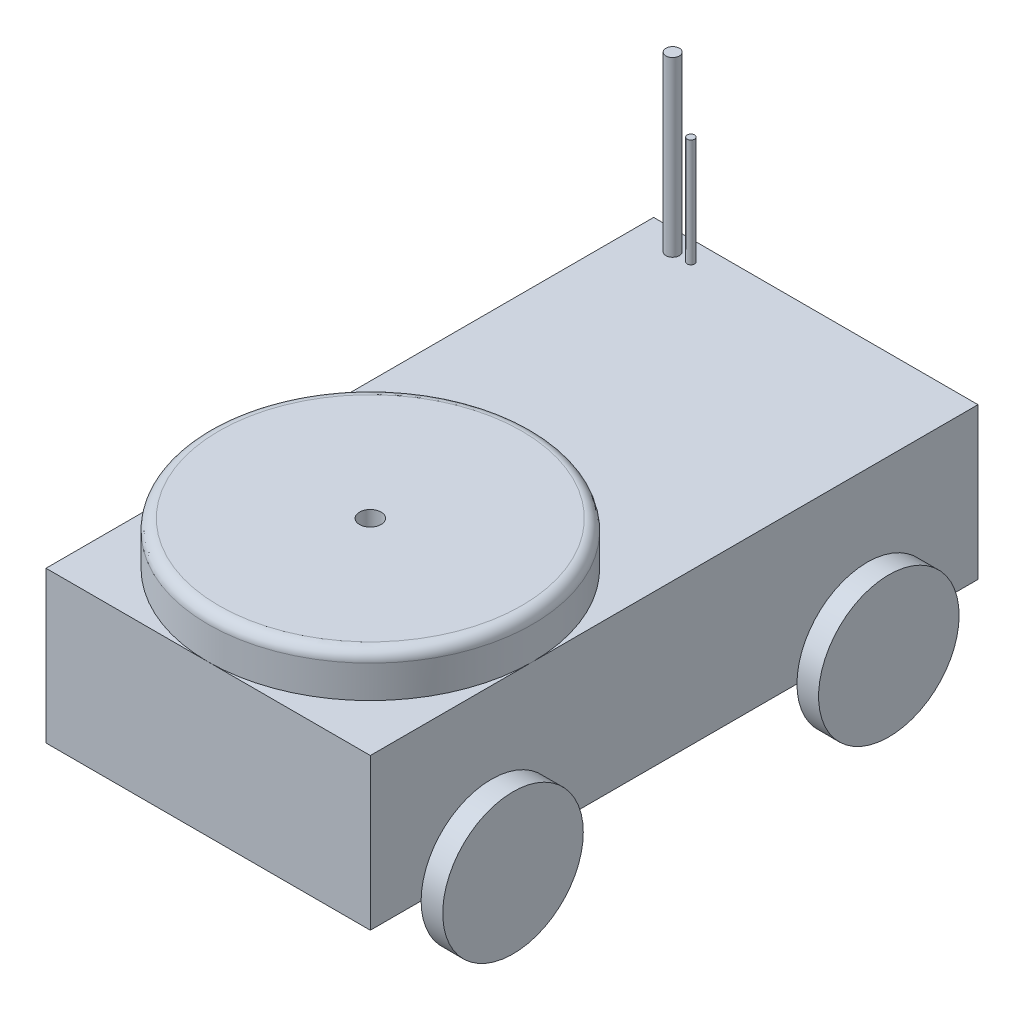
ISO-10303-21;
HEADER;
FILE_DESCRIPTION(('STEP AP214'),'2;1');
FILE_NAME('part.step','',(''),(''),'','','');
FILE_SCHEMA(('AUTOMOTIVE_DESIGN { 1 0 10303 214 1 1 1 1 }'));
ENDSEC;
DATA;
#1=APPLICATION_CONTEXT('core data for automotive mechanical design processes');
#2=APPLICATION_PROTOCOL_DEFINITION('international standard','automotive_design',2000,#1);
#3=PRODUCT_CONTEXT('',#1,'mechanical');
#4=PRODUCT('Part','Part','',(#3));
#5=PRODUCT_RELATED_PRODUCT_CATEGORY('part','',(#4));
#6=PRODUCT_DEFINITION_FORMATION('','',#4);
#7=PRODUCT_DEFINITION_CONTEXT('part definition',#1,'design');
#8=PRODUCT_DEFINITION('design','',#6,#7);
#9=PRODUCT_DEFINITION_SHAPE('','',#8);
#10=(LENGTH_UNIT() NAMED_UNIT(*) SI_UNIT(.MILLI.,.METRE.));
#11=(NAMED_UNIT(*) PLANE_ANGLE_UNIT() SI_UNIT($,.RADIAN.));
#12=(NAMED_UNIT(*) SI_UNIT($,.STERADIAN.) SOLID_ANGLE_UNIT());
#13=UNCERTAINTY_MEASURE_WITH_UNIT(LENGTH_MEASURE(1.E-05),#10,'distance_accuracy_value','');
#14=(GEOMETRIC_REPRESENTATION_CONTEXT(3) GLOBAL_UNCERTAINTY_ASSIGNED_CONTEXT((#13)) GLOBAL_UNIT_ASSIGNED_CONTEXT((#10,
#11,#12)) REPRESENTATION_CONTEXT('',''));
#15=CARTESIAN_POINT('',(0.,0.,0.));
#16=DIRECTION('',(0.,0.,1.));
#17=DIRECTION('',(1.,0.,0.));
#18=AXIS2_PLACEMENT_3D('',#15,#16,#17);
#19=CARTESIAN_POINT('',(0.,20.,0.));
#20=DIRECTION('',(0.,-1.,0.));
#21=DIRECTION('',(0.,0.,-1.));
#22=AXIS2_PLACEMENT_3D('',#19,#20,#21);
#23=CYLINDRICAL_SURFACE('',#22,75.);
#24=CARTESIAN_POINT('',(0.,15.,0.));
#25=DIRECTION('',(0.,1.,0.));
#26=DIRECTION('',(0.,0.,1.));
#27=AXIS2_PLACEMENT_3D('',#24,#25,#26);
#28=CIRCLE('',#27,75.);
#29=CARTESIAN_POINT('',(0.,15.,75.));
#30=VERTEX_POINT('',#29);
#31=EDGE_CURVE('E180',#30,#30,#28,.F.);
#32=ORIENTED_EDGE('',*,*,#31,.T.);
#33=EDGE_LOOP('',(#32));
#34=FACE_BOUND('',#33,.T.);
#35=CARTESIAN_POINT('',(0.,0.,0.));
#36=DIRECTION('',(0.,1.,0.));
#37=DIRECTION('',(0.,0.,1.));
#38=AXIS2_PLACEMENT_3D('',#35,#36,#37);
#39=CIRCLE('',#38,75.);
#40=CARTESIAN_POINT('',(0.,0.,75.));
#41=VERTEX_POINT('',#40);
#42=CARTESIAN_POINT('',(75.,0.,0.));
#43=VERTEX_POINT('',#42);
#44=EDGE_CURVE('E173',#41,#43,#39,.T.);
#45=ORIENTED_EDGE('',*,*,#44,.T.);
#46=CARTESIAN_POINT('',(-75.,0.,0.));
#47=VERTEX_POINT('',#46);
#48=EDGE_CURVE('E177',#43,#47,#39,.T.);
#49=ORIENTED_EDGE('',*,*,#48,.T.);
#50=EDGE_CURVE('E170',#47,#41,#39,.T.);
#51=ORIENTED_EDGE('',*,*,#50,.T.);
#52=EDGE_LOOP('',(#45,#49,#51));
#53=FACE_BOUND('',#52,.T.);
#54=ADVANCED_FACE('F39',(#34,#53),#23,.T.);
#55=CARTESIAN_POINT('',(0.,20.,0.));
#56=DIRECTION('',(0.,1.,0.));
#57=DIRECTION('',(0.,0.,1.));
#58=AXIS2_PLACEMENT_3D('',#55,#56,#57);
#59=PLANE('',#58);
#60=CARTESIAN_POINT('',(0.,20.,0.));
#61=DIRECTION('',(0.,1.,0.));
#62=DIRECTION('',(0.,0.,1.));
#63=AXIS2_PLACEMENT_3D('',#60,#61,#62);
#64=CIRCLE('',#63,5.);
#65=CARTESIAN_POINT('',(0.,20.,5.));
#66=VERTEX_POINT('',#65);
#67=EDGE_CURVE('E167',#66,#66,#64,.T.);
#68=ORIENTED_EDGE('',*,*,#67,.F.);
#69=EDGE_LOOP('',(#68));
#70=FACE_BOUND('',#69,.T.);
#71=CARTESIAN_POINT('',(0.,20.,0.));
#72=DIRECTION('',(0.,1.,0.));
#73=DIRECTION('',(0.,0.,1.));
#74=AXIS2_PLACEMENT_3D('',#71,#72,#73);
#75=CIRCLE('',#74,70.);
#76=CARTESIAN_POINT('',(0.,20.,70.));
#77=VERTEX_POINT('',#76);
#78=EDGE_CURVE('E176',#77,#77,#75,.T.);
#79=ORIENTED_EDGE('',*,*,#78,.T.);
#80=EDGE_LOOP('',(#79));
#81=FACE_BOUND('',#80,.T.);
#82=ADVANCED_FACE('F244',(#70,#81),#59,.T.);
#83=CARTESIAN_POINT('',(0.,15.,0.));
#84=DIRECTION('',(0.,1.,0.));
#85=DIRECTION('',(0.,0.,1.));
#86=AXIS2_PLACEMENT_3D('',#83,#84,#85);
#87=TOROIDAL_SURFACE('',#86,70.,5.);
#88=ORIENTED_EDGE('',*,*,#31,.F.);
#89=EDGE_LOOP('',(#88));
#90=FACE_BOUND('',#89,.T.);
#91=ORIENTED_EDGE('',*,*,#78,.F.);
#92=EDGE_LOOP('',(#91));
#93=FACE_BOUND('',#92,.T.);
#94=ADVANCED_FACE('F41',(#90,#93),#87,.T.);
#95=CARTESIAN_POINT('',(0.,20.,0.));
#96=DIRECTION('',(0.,-1.,0.));
#97=DIRECTION('',(0.,0.,-1.));
#98=AXIS2_PLACEMENT_3D('',#95,#96,#97);
#99=CYLINDRICAL_SURFACE('',#98,5.);
#100=ORIENTED_EDGE('',*,*,#67,.T.);
#101=EDGE_LOOP('',(#100));
#102=FACE_BOUND('',#101,.T.);
#103=CARTESIAN_POINT('',(0.,10.,0.));
#104=DIRECTION('',(0.,1.,0.));
#105=DIRECTION('',(0.,0.,1.));
#106=AXIS2_PLACEMENT_3D('',#103,#104,#105);
#107=CIRCLE('',#106,5.);
#108=CARTESIAN_POINT('',(0.,10.,5.));
#109=VERTEX_POINT('',#108);
#110=EDGE_CURVE('E166',#109,#109,#107,.T.);
#111=ORIENTED_EDGE('',*,*,#110,.F.);
#112=EDGE_LOOP('',(#111));
#113=FACE_BOUND('',#112,.T.);
#114=ADVANCED_FACE('F252',(#102,#113),#99,.F.);
#115=CARTESIAN_POINT('',(0.,10.,0.));
#116=DIRECTION('',(0.,1.,0.));
#117=DIRECTION('',(0.,0.,1.));
#118=AXIS2_PLACEMENT_3D('',#115,#116,#117);
#119=PLANE('',#118);
#120=ORIENTED_EDGE('',*,*,#110,.T.);
#121=EDGE_LOOP('',(#120));
#122=FACE_BOUND('',#121,.T.);
#123=ADVANCED_FACE('F255',(#122),#119,.T.);
#124=CARTESIAN_POINT('',(0.,0.,0.));
#125=DIRECTION('',(0.,-1.,0.));
#126=DIRECTION('',(0.,0.,-1.));
#127=AXIS2_PLACEMENT_3D('',#124,#125,#126);
#128=PLANE('',#127);
#129=ORIENTED_EDGE('',*,*,#44,.F.);
#130=DIRECTION('',(-1.,0.,0.));
#131=VECTOR('',#130,1.);
#132=CARTESIAN_POINT('',(-75.,0.,75.));
#133=LINE('',#132,#131);
#134=CARTESIAN_POINT('',(75.,0.,75.));
#135=VERTEX_POINT('',#134);
#136=EDGE_CURVE('E206',#135,#41,#133,.T.);
#137=ORIENTED_EDGE('',*,*,#136,.F.);
#138=DIRECTION('',(0.,0.,1.));
#139=VECTOR('',#138,1.);
#140=CARTESIAN_POINT('',(75.,0.,75.));
#141=LINE('',#140,#139);
#142=EDGE_CURVE('E205',#43,#135,#141,.T.);
#143=ORIENTED_EDGE('',*,*,#142,.F.);
#144=EDGE_LOOP('',(#129,#137,#143));
#145=FACE_BOUND('',#144,.T.);
#146=ADVANCED_FACE('F190',(#145),#128,.F.);
#147=CARTESIAN_POINT('',(-48.5777474499476,0.,-196.852154179683));
#148=DIRECTION('',(0.,-1.,0.));
#149=DIRECTION('',(0.,0.,-1.));
#150=AXIS2_PLACEMENT_3D('',#147,#148,#149);
#151=CIRCLE('',#150,1.72150087581956);
#152=CARTESIAN_POINT('',(-48.5777474499476,0.,-198.573655055502));
#153=VERTEX_POINT('',#152);
#154=EDGE_CURVE('E11',#153,#153,#151,.F.);
#155=ORIENTED_EDGE('',*,*,#154,.F.);
#156=EDGE_LOOP('',(#155));
#157=FACE_BOUND('',#156,.T.);
#158=CARTESIAN_POINT('',(-56.8266354819137,0.,-196.658461897024));
#159=DIRECTION('',(0.,-1.,0.));
#160=DIRECTION('',(0.,0.,-1.));
#161=AXIS2_PLACEMENT_3D('',#158,#159,#160);
#162=CIRCLE('',#161,3.10994561843031);
#163=CARTESIAN_POINT('',(-56.8266354819137,0.,-199.768407515455));
#164=VERTEX_POINT('',#163);
#165=EDGE_CURVE('E47',#164,#164,#162,.F.);
#166=ORIENTED_EDGE('',*,*,#165,.F.);
#167=EDGE_LOOP('',(#166));
#168=FACE_BOUND('',#167,.T.);
#169=ORIENTED_EDGE('',*,*,#48,.F.);
#170=CARTESIAN_POINT('',(75.,0.,-206.035433198381));
#171=VERTEX_POINT('',#170);
#172=EDGE_CURVE('E199',#171,#43,#141,.T.);
#173=ORIENTED_EDGE('',*,*,#172,.F.);
#174=DIRECTION('',(1.,0.,0.));
#175=VECTOR('',#174,1.);
#176=CARTESIAN_POINT('',(-75.,0.,-206.035433198381));
#177=LINE('',#176,#175);
#178=CARTESIAN_POINT('',(-75.,0.,-206.035433198381));
#179=VERTEX_POINT('',#178);
#180=EDGE_CURVE('E143',#179,#171,#177,.T.);
#181=ORIENTED_EDGE('',*,*,#180,.F.);
#182=DIRECTION('',(0.,0.,-1.));
#183=VECTOR('',#182,1.);
#184=CARTESIAN_POINT('',(-75.,0.,75.));
#185=LINE('',#184,#183);
#186=EDGE_CURVE('E152',#47,#179,#185,.T.);
#187=ORIENTED_EDGE('',*,*,#186,.F.);
#188=EDGE_LOOP('',(#169,#173,#181,#187));
#189=FACE_BOUND('',#188,.T.);
#190=ADVANCED_FACE('F187',(#157,#168,#189),#128,.F.);
#191=CARTESIAN_POINT('',(75.,-70.,75.));
#192=DIRECTION('',(-1.,0.,0.));
#193=DIRECTION('',(0.,0.,1.));
#194=AXIS2_PLACEMENT_3D('',#191,#192,#193);
#195=PLANE('',#194);
#196=CARTESIAN_POINT('',(75.,-70.,-154.802708442978));
#197=DIRECTION('',(1.,0.,0.));
#198=DIRECTION('',(0.,0.,-1.));
#199=AXIS2_PLACEMENT_3D('',#196,#197,#198);
#200=CIRCLE('',#199,32.5);
#201=CARTESIAN_POINT('',(75.,-70.,-187.302708442978));
#202=VERTEX_POINT('',#201);
#203=CARTESIAN_POINT('',(75.,-70.,-122.302708442978));
#204=VERTEX_POINT('',#203);
#205=EDGE_CURVE('E53',#202,#204,#200,.T.);
#206=ORIENTED_EDGE('',*,*,#205,.F.);
#207=DIRECTION('',(0.,0.,1.));
#208=VECTOR('',#207,1.);
#209=CARTESIAN_POINT('',(75.,-70.,75.));
#210=LINE('',#209,#208);
#211=CARTESIAN_POINT('',(75.,-70.,-206.035433198381));
#212=VERTEX_POINT('',#211);
#213=EDGE_CURVE('E120',#212,#202,#210,.T.);
#214=ORIENTED_EDGE('',*,*,#213,.F.);
#215=DIRECTION('',(0.,1.,0.));
#216=VECTOR('',#215,1.);
#217=CARTESIAN_POINT('',(75.,-70.,-206.035433198381));
#218=LINE('',#217,#216);
#219=EDGE_CURVE('E156',#212,#171,#218,.T.);
#220=ORIENTED_EDGE('',*,*,#219,.T.);
#221=ORIENTED_EDGE('',*,*,#172,.T.);
#222=ORIENTED_EDGE('',*,*,#142,.T.);
#223=DIRECTION('',(0.,1.,0.));
#224=VECTOR('',#223,1.);
#225=CARTESIAN_POINT('',(75.,-70.,75.));
#226=LINE('',#225,#224);
#227=CARTESIAN_POINT('',(75.,-70.,75.));
#228=VERTEX_POINT('',#227);
#229=EDGE_CURVE('E163',#228,#135,#226,.T.);
#230=ORIENTED_EDGE('',*,*,#229,.F.);
#231=CARTESIAN_POINT('',(75.,-70.,51.5162583589671));
#232=VERTEX_POINT('',#231);
#233=EDGE_CURVE('E123',#232,#228,#210,.T.);
#234=ORIENTED_EDGE('',*,*,#233,.F.);
#235=CARTESIAN_POINT('',(75.,-70.,19.0162583589671));
#236=DIRECTION('',(1.,0.,0.));
#237=DIRECTION('',(0.,0.,-1.));
#238=AXIS2_PLACEMENT_3D('',#235,#236,#237);
#239=CIRCLE('',#238,32.5);
#240=CARTESIAN_POINT('',(75.,-70.,-13.4837416410329));
#241=VERTEX_POINT('',#240);
#242=EDGE_CURVE('E60',#241,#232,#239,.T.);
#243=ORIENTED_EDGE('',*,*,#242,.F.);
#244=EDGE_CURVE('E121',#204,#241,#210,.T.);
#245=ORIENTED_EDGE('',*,*,#244,.F.);
#246=EDGE_LOOP('',(#206,#214,#220,#221,#222,#230,#234,#243,#245));
#247=FACE_BOUND('',#246,.T.);
#248=ADVANCED_FACE('F129',(#247),#195,.F.);
#249=CARTESIAN_POINT('',(-75.,-70.,75.));
#250=DIRECTION('',(0.,0.,-1.));
#251=DIRECTION('',(-1.,0.,0.));
#252=AXIS2_PLACEMENT_3D('',#249,#250,#251);
#253=PLANE('',#252);
#254=ORIENTED_EDGE('',*,*,#136,.T.);
#255=CARTESIAN_POINT('',(-75.,0.,75.));
#256=VERTEX_POINT('',#255);
#257=EDGE_CURVE('E210',#41,#256,#133,.T.);
#258=ORIENTED_EDGE('',*,*,#257,.T.);
#259=DIRECTION('',(0.,1.,0.));
#260=VECTOR('',#259,1.);
#261=CARTESIAN_POINT('',(-75.,-70.,75.));
#262=LINE('',#261,#260);
#263=CARTESIAN_POINT('',(-75.,-70.,75.));
#264=VERTEX_POINT('',#263);
#265=EDGE_CURVE('E160',#264,#256,#262,.T.);
#266=ORIENTED_EDGE('',*,*,#265,.F.);
#267=DIRECTION('',(-1.,0.,0.));
#268=VECTOR('',#267,1.);
#269=CARTESIAN_POINT('',(-75.,-70.,75.));
#270=LINE('',#269,#268);
#271=EDGE_CURVE('E136',#228,#264,#270,.T.);
#272=ORIENTED_EDGE('',*,*,#271,.F.);
#273=ORIENTED_EDGE('',*,*,#229,.T.);
#274=EDGE_LOOP('',(#254,#258,#266,#272,#273));
#275=FACE_BOUND('',#274,.T.);
#276=ADVANCED_FACE('F241',(#275),#253,.F.);
#277=CARTESIAN_POINT('',(-75.,-70.,75.));
#278=DIRECTION('',(1.,0.,0.));
#279=DIRECTION('',(0.,0.,-1.));
#280=AXIS2_PLACEMENT_3D('',#277,#278,#279);
#281=PLANE('',#280);
#282=CARTESIAN_POINT('',(-75.,-70.,19.0162583589671));
#283=DIRECTION('',(-1.,0.,0.));
#284=DIRECTION('',(0.,0.,1.));
#285=AXIS2_PLACEMENT_3D('',#282,#283,#284);
#286=CIRCLE('',#285,32.5);
#287=CARTESIAN_POINT('',(-75.,-70.,51.5162583589671));
#288=VERTEX_POINT('',#287);
#289=CARTESIAN_POINT('',(-75.,-70.,-13.4837416410329));
#290=VERTEX_POINT('',#289);
#291=EDGE_CURVE('E276',#288,#290,#286,.T.);
#292=ORIENTED_EDGE('',*,*,#291,.F.);
#293=DIRECTION('',(0.,0.,-1.));
#294=VECTOR('',#293,1.);
#295=CARTESIAN_POINT('',(-75.,-70.,75.));
#296=LINE('',#295,#294);
#297=EDGE_CURVE('E218',#264,#288,#296,.T.);
#298=ORIENTED_EDGE('',*,*,#297,.F.);
#299=ORIENTED_EDGE('',*,*,#265,.T.);
#300=EDGE_CURVE('E146',#256,#47,#185,.T.);
#301=ORIENTED_EDGE('',*,*,#300,.T.);
#302=ORIENTED_EDGE('',*,*,#186,.T.);
#303=DIRECTION('',(0.,1.,0.));
#304=VECTOR('',#303,1.);
#305=CARTESIAN_POINT('',(-75.,-70.,-206.035433198381));
#306=LINE('',#305,#304);
#307=CARTESIAN_POINT('',(-75.,-70.,-206.035433198381));
#308=VERTEX_POINT('',#307);
#309=EDGE_CURVE('E158',#308,#179,#306,.T.);
#310=ORIENTED_EDGE('',*,*,#309,.F.);
#311=CARTESIAN_POINT('',(-75.,-70.,-187.302708442978));
#312=VERTEX_POINT('',#311);
#313=EDGE_CURVE('E138',#312,#308,#296,.T.);
#314=ORIENTED_EDGE('',*,*,#313,.F.);
#315=CARTESIAN_POINT('',(-75.,-70.,-154.802708442978));
#316=DIRECTION('',(-1.,0.,0.));
#317=DIRECTION('',(0.,0.,1.));
#318=AXIS2_PLACEMENT_3D('',#315,#316,#317);
#319=CIRCLE('',#318,32.5);
#320=CARTESIAN_POINT('',(-75.,-70.,-122.302708442978));
#321=VERTEX_POINT('',#320);
#322=EDGE_CURVE('E279',#321,#312,#319,.T.);
#323=ORIENTED_EDGE('',*,*,#322,.F.);
#324=EDGE_CURVE('E221',#290,#321,#296,.T.);
#325=ORIENTED_EDGE('',*,*,#324,.F.);
#326=EDGE_LOOP('',(#292,#298,#299,#301,#302,#310,#314,#323,#325));
#327=FACE_BOUND('',#326,.T.);
#328=ADVANCED_FACE('F232',(#327),#281,.F.);
#329=CARTESIAN_POINT('',(-75.,-70.,-206.035433198381));
#330=DIRECTION('',(0.,0.,1.));
#331=DIRECTION('',(1.,0.,0.));
#332=AXIS2_PLACEMENT_3D('',#329,#330,#331);
#333=PLANE('',#332);
#334=ORIENTED_EDGE('',*,*,#180,.T.);
#335=ORIENTED_EDGE('',*,*,#219,.F.);
#336=DIRECTION('',(1.,0.,0.));
#337=VECTOR('',#336,1.);
#338=CARTESIAN_POINT('',(-75.,-70.,-206.035433198381));
#339=LINE('',#338,#337);
#340=EDGE_CURVE('E134',#308,#212,#339,.T.);
#341=ORIENTED_EDGE('',*,*,#340,.F.);
#342=ORIENTED_EDGE('',*,*,#309,.T.);
#343=EDGE_LOOP('',(#334,#335,#341,#342));
#344=FACE_BOUND('',#343,.T.);
#345=ADVANCED_FACE('F233',(#344),#333,.F.);
#346=CARTESIAN_POINT('',(0.,-70.,0.));
#347=DIRECTION('',(0.,-1.,0.));
#348=DIRECTION('',(0.,0.,-1.));
#349=AXIS2_PLACEMENT_3D('',#346,#347,#348);
#350=PLANE('',#349);
#351=ORIENTED_EDGE('',*,*,#213,.T.);
#352=EDGE_CURVE('E114',#202,#204,#210,.T.);
#353=ORIENTED_EDGE('',*,*,#352,.T.);
#354=ORIENTED_EDGE('',*,*,#244,.T.);
#355=EDGE_CURVE('E137',#241,#232,#210,.T.);
#356=ORIENTED_EDGE('',*,*,#355,.T.);
#357=ORIENTED_EDGE('',*,*,#233,.T.);
#358=ORIENTED_EDGE('',*,*,#271,.T.);
#359=ORIENTED_EDGE('',*,*,#297,.T.);
#360=EDGE_CURVE('E220',#288,#290,#296,.T.);
#361=ORIENTED_EDGE('',*,*,#360,.T.);
#362=ORIENTED_EDGE('',*,*,#324,.T.);
#363=EDGE_CURVE('E222',#321,#312,#296,.T.);
#364=ORIENTED_EDGE('',*,*,#363,.T.);
#365=ORIENTED_EDGE('',*,*,#313,.T.);
#366=ORIENTED_EDGE('',*,*,#340,.T.);
#367=EDGE_LOOP('',(#351,#353,#354,#356,#357,#358,#359,#361,#362,#364,#365,#366));
#368=FACE_BOUND('',#367,.T.);
#369=ADVANCED_FACE('F132',(#368),#350,.T.);
#370=ORIENTED_EDGE('',*,*,#50,.F.);
#371=ORIENTED_EDGE('',*,*,#300,.F.);
#372=ORIENTED_EDGE('',*,*,#257,.F.);
#373=EDGE_LOOP('',(#370,#371,#372));
#374=FACE_BOUND('',#373,.T.);
#375=ADVANCED_FACE('F193',(#374),#128,.F.);
#376=CARTESIAN_POINT('',(-85.,-70.,-154.802708442978));
#377=DIRECTION('',(1.,0.,0.));
#378=DIRECTION('',(0.,0.,-1.));
#379=AXIS2_PLACEMENT_3D('',#376,#377,#378);
#380=CYLINDRICAL_SURFACE('',#379,32.5);
#381=CARTESIAN_POINT('',(-85.,-70.,-154.802708442978));
#382=DIRECTION('',(-1.,0.,0.));
#383=DIRECTION('',(0.,0.,1.));
#384=AXIS2_PLACEMENT_3D('',#381,#382,#383);
#385=CIRCLE('',#384,32.5);
#386=CARTESIAN_POINT('',(-85.,-70.,-122.302708442978));
#387=VERTEX_POINT('',#386);
#388=EDGE_CURVE('E208',#387,#387,#385,.T.);
#389=ORIENTED_EDGE('',*,*,#388,.F.);
#390=EDGE_LOOP('',(#389));
#391=FACE_BOUND('',#390,.T.);
#392=ORIENTED_EDGE('',*,*,#322,.T.);
#393=EDGE_CURVE('E275',#312,#321,#319,.T.);
#394=ORIENTED_EDGE('',*,*,#393,.T.);
#395=EDGE_LOOP('',(#392,#394));
#396=FACE_BOUND('',#395,.T.);
#397=ADVANCED_FACE('F283',(#391,#396),#380,.T.);
#398=CARTESIAN_POINT('',(-85.,-70.,-154.802708442978));
#399=DIRECTION('',(-1.,0.,0.));
#400=DIRECTION('',(0.,0.,1.));
#401=AXIS2_PLACEMENT_3D('',#398,#399,#400);
#402=PLANE('',#401);
#403=ORIENTED_EDGE('',*,*,#388,.T.);
#404=EDGE_LOOP('',(#403));
#405=FACE_BOUND('',#404,.T.);
#406=ADVANCED_FACE('F303',(#405),#402,.T.);
#407=CARTESIAN_POINT('',(-75.,-70.,-154.802708442978));
#408=DIRECTION('',(-1.,0.,0.));
#409=DIRECTION('',(0.,0.,1.));
#410=AXIS2_PLACEMENT_3D('',#407,#408,#409);
#411=PLANE('',#410);
#412=ORIENTED_EDGE('',*,*,#363,.F.);
#413=ORIENTED_EDGE('',*,*,#393,.F.);
#414=EDGE_LOOP('',(#412,#413));
#415=FACE_BOUND('',#414,.T.);
#416=ADVANCED_FACE('F294',(#415),#411,.F.);
#417=CARTESIAN_POINT('',(-85.,-70.,19.0162583589671));
#418=DIRECTION('',(1.,0.,0.));
#419=DIRECTION('',(0.,0.,-1.));
#420=AXIS2_PLACEMENT_3D('',#417,#418,#419);
#421=CYLINDRICAL_SURFACE('',#420,32.5);
#422=CARTESIAN_POINT('',(-85.,-70.,19.0162583589671));
#423=DIRECTION('',(-1.,0.,0.));
#424=DIRECTION('',(0.,0.,1.));
#425=AXIS2_PLACEMENT_3D('',#422,#423,#424);
#426=CIRCLE('',#425,32.5);
#427=CARTESIAN_POINT('',(-85.,-70.,51.5162583589671));
#428=VERTEX_POINT('',#427);
#429=EDGE_CURVE('E272',#428,#428,#426,.T.);
#430=ORIENTED_EDGE('',*,*,#429,.F.);
#431=EDGE_LOOP('',(#430));
#432=FACE_BOUND('',#431,.T.);
#433=ORIENTED_EDGE('',*,*,#291,.T.);
#434=EDGE_CURVE('E269',#290,#288,#286,.T.);
#435=ORIENTED_EDGE('',*,*,#434,.T.);
#436=EDGE_LOOP('',(#433,#435));
#437=FACE_BOUND('',#436,.T.);
#438=ADVANCED_FACE('F291',(#432,#437),#421,.T.);
#439=CARTESIAN_POINT('',(-85.,-70.,19.0162583589671));
#440=DIRECTION('',(-1.,0.,0.));
#441=DIRECTION('',(0.,0.,1.));
#442=AXIS2_PLACEMENT_3D('',#439,#440,#441);
#443=PLANE('',#442);
#444=ORIENTED_EDGE('',*,*,#429,.T.);
#445=EDGE_LOOP('',(#444));
#446=FACE_BOUND('',#445,.T.);
#447=ADVANCED_FACE('F293',(#446),#443,.T.);
#448=CARTESIAN_POINT('',(-75.,-70.,19.0162583589671));
#449=DIRECTION('',(-1.,0.,0.));
#450=DIRECTION('',(0.,0.,1.));
#451=AXIS2_PLACEMENT_3D('',#448,#449,#450);
#452=PLANE('',#451);
#453=ORIENTED_EDGE('',*,*,#360,.F.);
#454=ORIENTED_EDGE('',*,*,#434,.F.);
#455=EDGE_LOOP('',(#453,#454));
#456=FACE_BOUND('',#455,.T.);
#457=ADVANCED_FACE('F289',(#456),#452,.F.);
#458=CARTESIAN_POINT('',(85.,-70.,19.0162583589671));
#459=DIRECTION('',(-1.,0.,0.));
#460=DIRECTION('',(0.,0.,1.));
#461=AXIS2_PLACEMENT_3D('',#458,#459,#460);
#462=CYLINDRICAL_SURFACE('',#461,32.5);
#463=CARTESIAN_POINT('',(85.,-70.,19.0162583589671));
#464=DIRECTION('',(1.,0.,0.));
#465=DIRECTION('',(0.,0.,-1.));
#466=AXIS2_PLACEMENT_3D('',#463,#464,#465);
#467=CIRCLE('',#466,32.5);
#468=CARTESIAN_POINT('',(85.,-70.,-13.4837416410329));
#469=VERTEX_POINT('',#468);
#470=EDGE_CURVE('E265',#469,#469,#467,.T.);
#471=ORIENTED_EDGE('',*,*,#470,.F.);
#472=EDGE_LOOP('',(#471));
#473=FACE_BOUND('',#472,.T.);
#474=ORIENTED_EDGE('',*,*,#242,.T.);
#475=EDGE_CURVE('E266',#232,#241,#239,.T.);
#476=ORIENTED_EDGE('',*,*,#475,.T.);
#477=EDGE_LOOP('',(#474,#476));
#478=FACE_BOUND('',#477,.T.);
#479=ADVANCED_FACE('F428',(#473,#478),#462,.T.);
#480=CARTESIAN_POINT('',(85.,-70.,19.0162583589671));
#481=DIRECTION('',(1.,0.,0.));
#482=DIRECTION('',(0.,0.,-1.));
#483=AXIS2_PLACEMENT_3D('',#480,#481,#482);
#484=PLANE('',#483);
#485=ORIENTED_EDGE('',*,*,#470,.T.);
#486=EDGE_LOOP('',(#485));
#487=FACE_BOUND('',#486,.T.);
#488=ADVANCED_FACE('F425',(#487),#484,.T.);
#489=CARTESIAN_POINT('',(75.,-70.,19.0162583589671));
#490=DIRECTION('',(1.,0.,0.));
#491=DIRECTION('',(0.,0.,-1.));
#492=AXIS2_PLACEMENT_3D('',#489,#490,#491);
#493=PLANE('',#492);
#494=ORIENTED_EDGE('',*,*,#355,.F.);
#495=ORIENTED_EDGE('',*,*,#475,.F.);
#496=EDGE_LOOP('',(#494,#495));
#497=FACE_BOUND('',#496,.T.);
#498=ADVANCED_FACE('F340',(#497),#493,.F.);
#499=CARTESIAN_POINT('',(85.,-70.,-154.802708442978));
#500=DIRECTION('',(-1.,0.,0.));
#501=DIRECTION('',(0.,0.,1.));
#502=AXIS2_PLACEMENT_3D('',#499,#500,#501);
#503=CYLINDRICAL_SURFACE('',#502,32.5);
#504=CARTESIAN_POINT('',(85.,-70.,-154.802708442978));
#505=DIRECTION('',(1.,0.,0.));
#506=DIRECTION('',(0.,0.,-1.));
#507=AXIS2_PLACEMENT_3D('',#504,#505,#506);
#508=CIRCLE('',#507,32.5);
#509=CARTESIAN_POINT('',(85.,-70.,-187.302708442978));
#510=VERTEX_POINT('',#509);
#511=EDGE_CURVE('E131',#510,#510,#508,.T.);
#512=ORIENTED_EDGE('',*,*,#511,.F.);
#513=EDGE_LOOP('',(#512));
#514=FACE_BOUND('',#513,.T.);
#515=ORIENTED_EDGE('',*,*,#205,.T.);
#516=EDGE_CURVE('E116',#204,#202,#200,.T.);
#517=ORIENTED_EDGE('',*,*,#516,.T.);
#518=EDGE_LOOP('',(#515,#517));
#519=FACE_BOUND('',#518,.T.);
#520=ADVANCED_FACE('F124',(#514,#519),#503,.T.);
#521=CARTESIAN_POINT('',(85.,-70.,-154.802708442978));
#522=DIRECTION('',(1.,0.,0.));
#523=DIRECTION('',(0.,0.,-1.));
#524=AXIS2_PLACEMENT_3D('',#521,#522,#523);
#525=PLANE('',#524);
#526=ORIENTED_EDGE('',*,*,#511,.T.);
#527=EDGE_LOOP('',(#526));
#528=FACE_BOUND('',#527,.T.);
#529=ADVANCED_FACE('F358',(#528),#525,.T.);
#530=CARTESIAN_POINT('',(75.,-70.,-154.802708442978));
#531=DIRECTION('',(1.,0.,0.));
#532=DIRECTION('',(0.,0.,-1.));
#533=AXIS2_PLACEMENT_3D('',#530,#531,#532);
#534=PLANE('',#533);
#535=ORIENTED_EDGE('',*,*,#352,.F.);
#536=ORIENTED_EDGE('',*,*,#516,.F.);
#537=EDGE_LOOP('',(#535,#536));
#538=FACE_BOUND('',#537,.T.);
#539=ADVANCED_FACE('F115',(#538),#534,.F.);
#540=CARTESIAN_POINT('',(-56.8266354819137,80.,-196.658461897024));
#541=DIRECTION('',(0.,-1.,0.));
#542=DIRECTION('',(0.,0.,-1.));
#543=AXIS2_PLACEMENT_3D('',#540,#541,#542);
#544=CYLINDRICAL_SURFACE('',#543,3.10994561843031);
#545=CARTESIAN_POINT('',(-56.8266354819137,80.,-196.658461897024));
#546=DIRECTION('',(0.,1.,0.));
#547=DIRECTION('',(0.,0.,1.));
#548=AXIS2_PLACEMENT_3D('',#545,#546,#547);
#549=CIRCLE('',#548,3.10994561843031);
#550=CARTESIAN_POINT('',(-56.8266354819137,80.,-193.548516278594));
#551=VERTEX_POINT('',#550);
#552=EDGE_CURVE('E125',#551,#551,#549,.T.);
#553=ORIENTED_EDGE('',*,*,#552,.F.);
#554=EDGE_LOOP('',(#553));
#555=FACE_BOUND('',#554,.T.);
#556=ORIENTED_EDGE('',*,*,#165,.T.);
#557=EDGE_LOOP('',(#556));
#558=FACE_BOUND('',#557,.T.);
#559=ADVANCED_FACE('F185',(#555,#558),#544,.T.);
#560=CARTESIAN_POINT('',(-56.8266354819137,80.,-196.658461897024));
#561=DIRECTION('',(0.,1.,0.));
#562=DIRECTION('',(0.,0.,1.));
#563=AXIS2_PLACEMENT_3D('',#560,#561,#562);
#564=PLANE('',#563);
#565=ORIENTED_EDGE('',*,*,#552,.T.);
#566=EDGE_LOOP('',(#565));
#567=FACE_BOUND('',#566,.T.);
#568=ADVANCED_FACE('F390',(#567),#564,.T.);
#569=CARTESIAN_POINT('',(-48.5777474499476,50.,-196.852154179683));
#570=DIRECTION('',(0.,-1.,0.));
#571=DIRECTION('',(0.,0.,-1.));
#572=AXIS2_PLACEMENT_3D('',#569,#570,#571);
#573=CYLINDRICAL_SURFACE('',#572,1.72150087581956);
#574=CARTESIAN_POINT('',(-48.5777474499476,50.,-196.852154179683));
#575=DIRECTION('',(0.,1.,0.));
#576=DIRECTION('',(0.,0.,1.));
#577=AXIS2_PLACEMENT_3D('',#574,#575,#576);
#578=CIRCLE('',#577,1.72150087581956);
#579=CARTESIAN_POINT('',(-48.5777474499476,50.,-195.130653303863));
#580=VERTEX_POINT('',#579);
#581=EDGE_CURVE('E517',#580,#580,#578,.T.);
#582=ORIENTED_EDGE('',*,*,#581,.F.);
#583=EDGE_LOOP('',(#582));
#584=FACE_BOUND('',#583,.T.);
#585=ORIENTED_EDGE('',*,*,#154,.T.);
#586=EDGE_LOOP('',(#585));
#587=FACE_BOUND('',#586,.T.);
#588=ADVANCED_FACE('F399',(#584,#587),#573,.T.);
#589=CARTESIAN_POINT('',(-48.5777474499476,50.,-196.852154179683));
#590=DIRECTION('',(0.,1.,0.));
#591=DIRECTION('',(0.,0.,1.));
#592=AXIS2_PLACEMENT_3D('',#589,#590,#591);
#593=PLANE('',#592);
#594=ORIENTED_EDGE('',*,*,#581,.T.);
#595=EDGE_LOOP('',(#594));
#596=FACE_BOUND('',#595,.T.);
#597=ADVANCED_FACE('F409',(#596),#593,.T.);
#598=CLOSED_SHELL('',(#54,#82,#94,#114,#123,#146,#190,#248,#276,#328,#345,#369,#375,#397,#406,
#416,#438,#447,#457,#479,#488,#498,#520,#529,#539,#559,#568,#588,#597));
#599=MANIFOLD_SOLID_BREP('B2',#598);
#600=ADVANCED_BREP_SHAPE_REPRESENTATION('',(#18,#599),#14);
#601=SHAPE_DEFINITION_REPRESENTATION(#9,#600);
ENDSEC;
END-ISO-10303-21;
